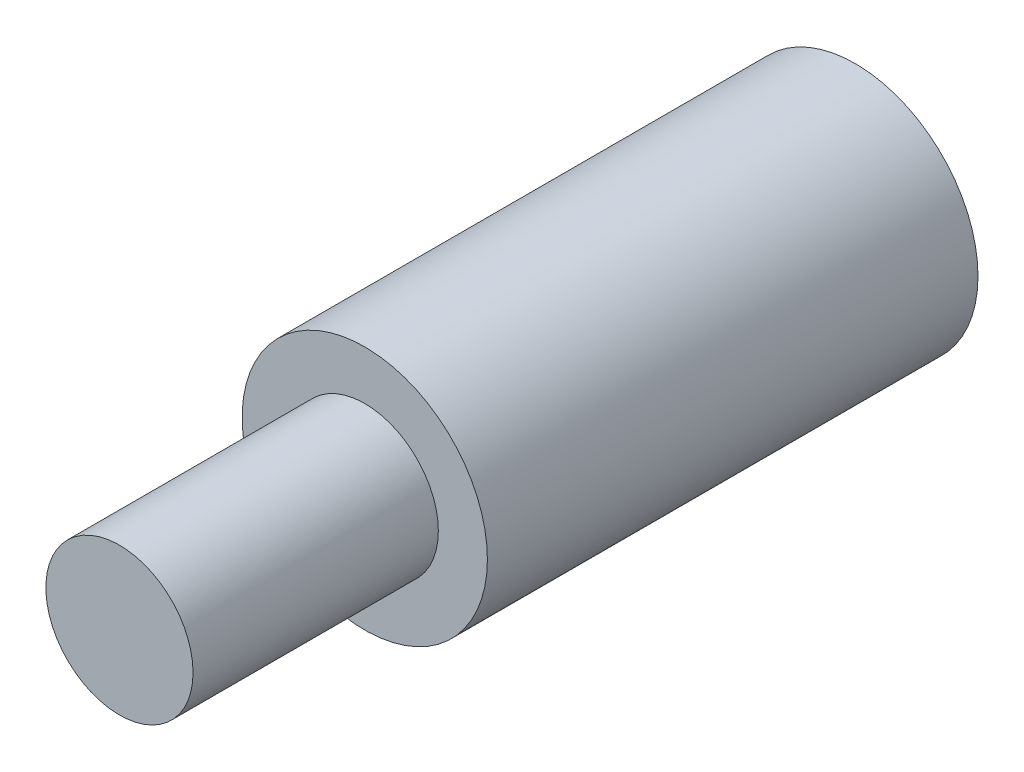
ISO-10303-21;
HEADER;
FILE_DESCRIPTION(('STEP AP214'),'2;1');
FILE_NAME('part.step','',(''),(''),'','','');
FILE_SCHEMA(('AUTOMOTIVE_DESIGN { 1 0 10303 214 1 1 1 1 }'));
ENDSEC;
DATA;
#1=APPLICATION_CONTEXT('core data for automotive mechanical design processes');
#2=APPLICATION_PROTOCOL_DEFINITION('international standard','automotive_design',2000,#1);
#3=PRODUCT_CONTEXT('',#1,'mechanical');
#4=PRODUCT('Part','Part','',(#3));
#5=PRODUCT_RELATED_PRODUCT_CATEGORY('part','',(#4));
#6=PRODUCT_DEFINITION_FORMATION('','',#4);
#7=PRODUCT_DEFINITION_CONTEXT('part definition',#1,'design');
#8=PRODUCT_DEFINITION('design','',#6,#7);
#9=PRODUCT_DEFINITION_SHAPE('','',#8);
#10=(LENGTH_UNIT() NAMED_UNIT(*) SI_UNIT(.MILLI.,.METRE.));
#11=(NAMED_UNIT(*) PLANE_ANGLE_UNIT() SI_UNIT($,.RADIAN.));
#12=(NAMED_UNIT(*) SI_UNIT($,.STERADIAN.) SOLID_ANGLE_UNIT());
#13=UNCERTAINTY_MEASURE_WITH_UNIT(LENGTH_MEASURE(1.E-05),#10,'distance_accuracy_value','');
#14=(GEOMETRIC_REPRESENTATION_CONTEXT(3) GLOBAL_UNCERTAINTY_ASSIGNED_CONTEXT((#13)) GLOBAL_UNIT_ASSIGNED_CONTEXT((#10,
#11,#12)) REPRESENTATION_CONTEXT('',''));
#15=CARTESIAN_POINT('',(0.,0.,0.));
#16=DIRECTION('',(0.,0.,1.));
#17=DIRECTION('',(1.,0.,0.));
#18=AXIS2_PLACEMENT_3D('',#15,#16,#17);
#19=CARTESIAN_POINT('',(0.,0.,10.));
#20=DIRECTION('',(0.,0.,-1.));
#21=DIRECTION('',(-1.,0.,0.));
#22=AXIS2_PLACEMENT_3D('',#19,#20,#21);
#23=CYLINDRICAL_SURFACE('',#22,2.5);
#24=CARTESIAN_POINT('',(0.,0.,10.));
#25=DIRECTION('',(0.,0.,1.));
#26=DIRECTION('',(1.,0.,0.));
#27=AXIS2_PLACEMENT_3D('',#24,#25,#26);
#28=CIRCLE('',#27,2.5);
#29=CARTESIAN_POINT('',(2.5,0.,10.));
#30=VERTEX_POINT('',#29);
#31=EDGE_CURVE('E38',#30,#30,#28,.T.);
#32=ORIENTED_EDGE('',*,*,#31,.F.);
#33=EDGE_LOOP('',(#32));
#34=FACE_BOUND('',#33,.T.);
#35=CARTESIAN_POINT('',(0.,0.,0.));
#36=DIRECTION('',(0.,0.,1.));
#37=DIRECTION('',(1.,0.,0.));
#38=AXIS2_PLACEMENT_3D('',#35,#36,#37);
#39=CIRCLE('',#38,2.5);
#40=CARTESIAN_POINT('',(2.5,0.,0.));
#41=VERTEX_POINT('',#40);
#42=EDGE_CURVE('E34',#41,#41,#39,.T.);
#43=ORIENTED_EDGE('',*,*,#42,.T.);
#44=EDGE_LOOP('',(#43));
#45=FACE_BOUND('',#44,.T.);
#46=ADVANCED_FACE('F31',(#34,#45),#23,.T.);
#47=CARTESIAN_POINT('',(0.,0.,10.));
#48=DIRECTION('',(0.,0.,1.));
#49=DIRECTION('',(1.,0.,0.));
#50=AXIS2_PLACEMENT_3D('',#47,#48,#49);
#51=PLANE('',#50);
#52=CARTESIAN_POINT('',(0.,0.,10.));
#53=DIRECTION('',(0.,0.,1.));
#54=DIRECTION('',(1.,0.,0.));
#55=AXIS2_PLACEMENT_3D('',#52,#53,#54);
#56=CIRCLE('',#55,1.5);
#57=CARTESIAN_POINT('',(1.5,0.,10.));
#58=VERTEX_POINT('',#57);
#59=EDGE_CURVE('E10',#58,#58,#56,.T.);
#60=ORIENTED_EDGE('',*,*,#59,.F.);
#61=EDGE_LOOP('',(#60));
#62=FACE_BOUND('',#61,.T.);
#63=ORIENTED_EDGE('',*,*,#31,.T.);
#64=EDGE_LOOP('',(#63));
#65=FACE_BOUND('',#64,.T.);
#66=ADVANCED_FACE('F67',(#62,#65),#51,.T.);
#67=CARTESIAN_POINT('',(0.,0.,0.));
#68=DIRECTION('',(0.,0.,1.));
#69=DIRECTION('',(1.,0.,0.));
#70=AXIS2_PLACEMENT_3D('',#67,#68,#69);
#71=PLANE('',#70);
#72=CARTESIAN_POINT('',(0.,0.,0.));
#73=DIRECTION('',(0.,0.,-1.));
#74=DIRECTION('',(-1.,0.,0.));
#75=AXIS2_PLACEMENT_3D('',#72,#73,#74);
#76=CIRCLE('',#75,1.5);
#77=CARTESIAN_POINT('',(-1.5,0.,0.));
#78=VERTEX_POINT('',#77);
#79=EDGE_CURVE('E48',#78,#78,#76,.T.);
#80=ORIENTED_EDGE('',*,*,#79,.F.);
#81=EDGE_LOOP('',(#80));
#82=FACE_BOUND('',#81,.T.);
#83=ORIENTED_EDGE('',*,*,#42,.F.);
#84=EDGE_LOOP('',(#83));
#85=FACE_BOUND('',#84,.T.);
#86=ADVANCED_FACE('F63',(#82,#85),#71,.F.);
#87=CARTESIAN_POINT('',(0.,0.,15.));
#88=DIRECTION('',(0.,0.,-1.));
#89=DIRECTION('',(-1.,0.,0.));
#90=AXIS2_PLACEMENT_3D('',#87,#88,#89);
#91=CYLINDRICAL_SURFACE('',#90,1.5);
#92=CARTESIAN_POINT('',(0.,0.,15.));
#93=DIRECTION('',(0.,0.,1.));
#94=DIRECTION('',(1.,0.,0.));
#95=AXIS2_PLACEMENT_3D('',#92,#93,#94);
#96=CIRCLE('',#95,1.5);
#97=CARTESIAN_POINT('',(1.5,0.,15.));
#98=VERTEX_POINT('',#97);
#99=EDGE_CURVE('E44',#98,#98,#96,.T.);
#100=ORIENTED_EDGE('',*,*,#99,.F.);
#101=EDGE_LOOP('',(#100));
#102=FACE_BOUND('',#101,.T.);
#103=ORIENTED_EDGE('',*,*,#59,.T.);
#104=EDGE_LOOP('',(#103));
#105=FACE_BOUND('',#104,.T.);
#106=ADVANCED_FACE('F66',(#102,#105),#91,.T.);
#107=CARTESIAN_POINT('',(0.,0.,15.));
#108=DIRECTION('',(0.,0.,1.));
#109=DIRECTION('',(1.,0.,0.));
#110=AXIS2_PLACEMENT_3D('',#107,#108,#109);
#111=PLANE('',#110);
#112=ORIENTED_EDGE('',*,*,#99,.T.);
#113=EDGE_LOOP('',(#112));
#114=FACE_BOUND('',#113,.T.);
#115=ADVANCED_FACE('F59',(#114),#111,.T.);
#116=CARTESIAN_POINT('',(0.,0.,5.));
#117=DIRECTION('',(0.,0.,-1.));
#118=DIRECTION('',(-1.,0.,0.));
#119=AXIS2_PLACEMENT_3D('',#116,#117,#118);
#120=CYLINDRICAL_SURFACE('',#119,1.5);
#121=CARTESIAN_POINT('',(0.,0.,5.));
#122=DIRECTION('',(0.,0.,-1.));
#123=DIRECTION('',(-1.,0.,0.));
#124=AXIS2_PLACEMENT_3D('',#121,#122,#123);
#125=CIRCLE('',#124,1.5);
#126=CARTESIAN_POINT('',(-1.5,0.,5.));
#127=VERTEX_POINT('',#126);
#128=EDGE_CURVE('E47',#127,#127,#125,.T.);
#129=ORIENTED_EDGE('',*,*,#128,.F.);
#130=EDGE_LOOP('',(#129));
#131=FACE_BOUND('',#130,.T.);
#132=ORIENTED_EDGE('',*,*,#79,.T.);
#133=EDGE_LOOP('',(#132));
#134=FACE_BOUND('',#133,.T.);
#135=ADVANCED_FACE('F56',(#131,#134),#120,.F.);
#136=CARTESIAN_POINT('',(0.,0.,5.));
#137=DIRECTION('',(0.,0.,-1.));
#138=DIRECTION('',(-1.,0.,0.));
#139=AXIS2_PLACEMENT_3D('',#136,#137,#138);
#140=PLANE('',#139);
#141=ORIENTED_EDGE('',*,*,#128,.T.);
#142=EDGE_LOOP('',(#141));
#143=FACE_BOUND('',#142,.T.);
#144=ADVANCED_FACE('F54',(#143),#140,.T.);
#145=CLOSED_SHELL('',(#46,#66,#86,#106,#115,#135,#144));
#146=MANIFOLD_SOLID_BREP('B2',#145);
#147=ADVANCED_BREP_SHAPE_REPRESENTATION('',(#18,#146),#14);
#148=SHAPE_DEFINITION_REPRESENTATION(#9,#147);
ENDSEC;
END-ISO-10303-21;
